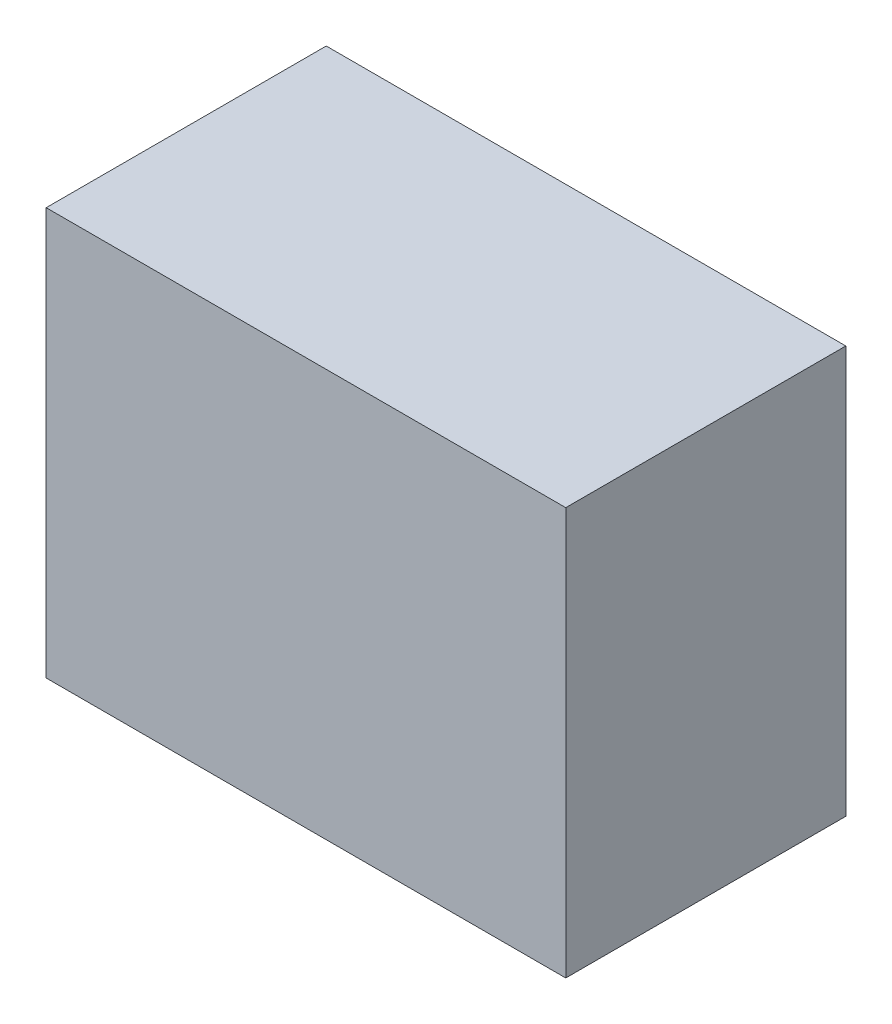
ISO-10303-21;
HEADER;
FILE_DESCRIPTION(('STEP AP214'),'2;1');
FILE_NAME('part.step','',(''),(''),'','','');
FILE_SCHEMA(('AUTOMOTIVE_DESIGN { 1 0 10303 214 1 1 1 1 }'));
ENDSEC;
DATA;
#1=APPLICATION_CONTEXT('core data for automotive mechanical design processes');
#2=APPLICATION_PROTOCOL_DEFINITION('international standard','automotive_design',2000,#1);
#3=PRODUCT_CONTEXT('',#1,'mechanical');
#4=PRODUCT('Part','Part','',(#3));
#5=PRODUCT_RELATED_PRODUCT_CATEGORY('part','',(#4));
#6=PRODUCT_DEFINITION_FORMATION('','',#4);
#7=PRODUCT_DEFINITION_CONTEXT('part definition',#1,'design');
#8=PRODUCT_DEFINITION('design','',#6,#7);
#9=PRODUCT_DEFINITION_SHAPE('','',#8);
#10=(LENGTH_UNIT() NAMED_UNIT(*) SI_UNIT(.MILLI.,.METRE.));
#11=(NAMED_UNIT(*) PLANE_ANGLE_UNIT() SI_UNIT($,.RADIAN.));
#12=(NAMED_UNIT(*) SI_UNIT($,.STERADIAN.) SOLID_ANGLE_UNIT());
#13=UNCERTAINTY_MEASURE_WITH_UNIT(LENGTH_MEASURE(1.E-05),#10,'distance_accuracy_value','');
#14=(GEOMETRIC_REPRESENTATION_CONTEXT(3) GLOBAL_UNCERTAINTY_ASSIGNED_CONTEXT((#13)) GLOBAL_UNIT_ASSIGNED_CONTEXT((#10,
#11,#12)) REPRESENTATION_CONTEXT('',''));
#15=CARTESIAN_POINT('',(0.,0.,0.));
#16=DIRECTION('',(0.,0.,1.));
#17=DIRECTION('',(1.,0.,0.));
#18=AXIS2_PLACEMENT_3D('',#15,#16,#17);
#19=CARTESIAN_POINT('',(0.,0.,0.539));
#20=DIRECTION('',(0.,0.,1.));
#21=DIRECTION('',(1.,0.,0.));
#22=AXIS2_PLACEMENT_3D('',#19,#20,#21);
#23=PLANE('',#22);
#24=DIRECTION('',(0.,1.,0.));
#25=VECTOR('',#24,1.);
#26=CARTESIAN_POINT('',(1.,0.,0.539));
#27=LINE('',#26,#25);
#28=CARTESIAN_POINT('',(1.,0.784,0.539));
#29=VERTEX_POINT('',#28);
#30=CARTESIAN_POINT('',(1.,0.,0.539));
#31=VERTEX_POINT('',#30);
#32=EDGE_CURVE('E76',#29,#31,#27,.F.);
#33=ORIENTED_EDGE('',*,*,#32,.F.);
#34=DIRECTION('',(1.,0.,0.));
#35=VECTOR('',#34,1.);
#36=CARTESIAN_POINT('',(0.,0.784,0.539));
#37=LINE('',#36,#35);
#38=CARTESIAN_POINT('',(0.,0.784,0.539));
#39=VERTEX_POINT('',#38);
#40=EDGE_CURVE('E58',#39,#29,#37,.T.);
#41=ORIENTED_EDGE('',*,*,#40,.F.);
#42=DIRECTION('',(0.,1.,0.));
#43=VECTOR('',#42,1.);
#44=CARTESIAN_POINT('',(0.,0.,0.539));
#45=LINE('',#44,#43);
#46=CARTESIAN_POINT('',(0.,0.,0.539));
#47=VERTEX_POINT('',#46);
#48=EDGE_CURVE('E20',#39,#47,#45,.F.);
#49=ORIENTED_EDGE('',*,*,#48,.T.);
#50=DIRECTION('',(1.,0.,0.));
#51=VECTOR('',#50,1.);
#52=CARTESIAN_POINT('',(0.,0.,0.539));
#53=LINE('',#52,#51);
#54=EDGE_CURVE('E55',#47,#31,#53,.T.);
#55=ORIENTED_EDGE('',*,*,#54,.T.);
#56=EDGE_LOOP('',(#33,#41,#49,#55));
#57=FACE_BOUND('',#56,.T.);
#58=ADVANCED_FACE('F17',(#57),#23,.T.);
#59=CARTESIAN_POINT('',(0.,0.,0.));
#60=DIRECTION('',(1.,0.,0.));
#61=DIRECTION('',(0.,0.,-1.));
#62=AXIS2_PLACEMENT_3D('',#59,#60,#61);
#63=PLANE('',#62);
#64=DIRECTION('',(0.,0.,1.));
#65=VECTOR('',#64,1.);
#66=CARTESIAN_POINT('',(0.,0.784,0.));
#67=LINE('',#66,#65);
#68=CARTESIAN_POINT('',(0.,0.784,0.));
#69=VERTEX_POINT('',#68);
#70=EDGE_CURVE('E78',#69,#39,#67,.T.);
#71=ORIENTED_EDGE('',*,*,#70,.F.);
#72=DIRECTION('',(0.,1.,0.));
#73=VECTOR('',#72,1.);
#74=CARTESIAN_POINT('',(0.,0.,0.));
#75=LINE('',#74,#73);
#76=CARTESIAN_POINT('',(0.,0.,0.));
#77=VERTEX_POINT('',#76);
#78=EDGE_CURVE('E73',#69,#77,#75,.F.);
#79=ORIENTED_EDGE('',*,*,#78,.T.);
#80=DIRECTION('',(0.,0.,1.));
#81=VECTOR('',#80,1.);
#82=CARTESIAN_POINT('',(0.,0.,0.));
#83=LINE('',#82,#81);
#84=EDGE_CURVE('E63',#77,#47,#83,.T.);
#85=ORIENTED_EDGE('',*,*,#84,.T.);
#86=ORIENTED_EDGE('',*,*,#48,.F.);
#87=EDGE_LOOP('',(#71,#79,#85,#86));
#88=FACE_BOUND('',#87,.T.);
#89=ADVANCED_FACE('F72',(#88),#63,.F.);
#90=CARTESIAN_POINT('',(0.,0.,0.));
#91=DIRECTION('',(0.,1.,0.));
#92=DIRECTION('',(0.,0.,1.));
#93=AXIS2_PLACEMENT_3D('',#90,#91,#92);
#94=PLANE('',#93);
#95=ORIENTED_EDGE('',*,*,#54,.F.);
#96=ORIENTED_EDGE('',*,*,#84,.F.);
#97=DIRECTION('',(1.,0.,0.));
#98=VECTOR('',#97,1.);
#99=CARTESIAN_POINT('',(0.,0.,0.));
#100=LINE('',#99,#98);
#101=CARTESIAN_POINT('',(1.,0.,0.));
#102=VERTEX_POINT('',#101);
#103=EDGE_CURVE('E83',#77,#102,#100,.T.);
#104=ORIENTED_EDGE('',*,*,#103,.T.);
#105=DIRECTION('',(0.,0.,-1.));
#106=VECTOR('',#105,1.);
#107=CARTESIAN_POINT('',(1.,0.,0.));
#108=LINE('',#107,#106);
#109=EDGE_CURVE('E69',#31,#102,#108,.T.);
#110=ORIENTED_EDGE('',*,*,#109,.F.);
#111=EDGE_LOOP('',(#95,#96,#104,#110));
#112=FACE_BOUND('',#111,.T.);
#113=ADVANCED_FACE('F66',(#112),#94,.F.);
#114=CARTESIAN_POINT('',(1.,0.,0.));
#115=DIRECTION('',(1.,0.,0.));
#116=DIRECTION('',(0.,0.,-1.));
#117=AXIS2_PLACEMENT_3D('',#114,#115,#116);
#118=PLANE('',#117);
#119=DIRECTION('',(0.,0.,1.));
#120=VECTOR('',#119,1.);
#121=CARTESIAN_POINT('',(1.,0.784,0.));
#122=LINE('',#121,#120);
#123=CARTESIAN_POINT('',(1.,0.784,0.));
#124=VERTEX_POINT('',#123);
#125=EDGE_CURVE('E34',#29,#124,#122,.F.);
#126=ORIENTED_EDGE('',*,*,#125,.F.);
#127=ORIENTED_EDGE('',*,*,#32,.T.);
#128=ORIENTED_EDGE('',*,*,#109,.T.);
#129=DIRECTION('',(0.,1.,0.));
#130=VECTOR('',#129,1.);
#131=CARTESIAN_POINT('',(1.,0.,0.));
#132=LINE('',#131,#130);
#133=EDGE_CURVE('E26',#102,#124,#132,.T.);
#134=ORIENTED_EDGE('',*,*,#133,.T.);
#135=EDGE_LOOP('',(#126,#127,#128,#134));
#136=FACE_BOUND('',#135,.T.);
#137=ADVANCED_FACE('F88',(#136),#118,.T.);
#138=CARTESIAN_POINT('',(0.,0.784,0.));
#139=DIRECTION('',(0.,1.,0.));
#140=DIRECTION('',(0.,0.,1.));
#141=AXIS2_PLACEMENT_3D('',#138,#139,#140);
#142=PLANE('',#141);
#143=ORIENTED_EDGE('',*,*,#40,.T.);
#144=ORIENTED_EDGE('',*,*,#125,.T.);
#145=DIRECTION('',(1.,0.,0.));
#146=VECTOR('',#145,1.);
#147=CARTESIAN_POINT('',(0.,0.784,0.));
#148=LINE('',#147,#146);
#149=EDGE_CURVE('E11',#124,#69,#148,.F.);
#150=ORIENTED_EDGE('',*,*,#149,.T.);
#151=ORIENTED_EDGE('',*,*,#70,.T.);
#152=EDGE_LOOP('',(#143,#144,#150,#151));
#153=FACE_BOUND('',#152,.T.);
#154=ADVANCED_FACE('F91',(#153),#142,.T.);
#155=CARTESIAN_POINT('',(0.,0.,0.));
#156=DIRECTION('',(0.,0.,1.));
#157=DIRECTION('',(1.,0.,0.));
#158=AXIS2_PLACEMENT_3D('',#155,#156,#157);
#159=PLANE('',#158);
#160=ORIENTED_EDGE('',*,*,#133,.F.);
#161=ORIENTED_EDGE('',*,*,#103,.F.);
#162=ORIENTED_EDGE('',*,*,#78,.F.);
#163=ORIENTED_EDGE('',*,*,#149,.F.);
#164=EDGE_LOOP('',(#160,#161,#162,#163));
#165=FACE_BOUND('',#164,.T.);
#166=ADVANCED_FACE('F90',(#165),#159,.F.);
#167=CLOSED_SHELL('',(#58,#89,#113,#137,#154,#166));
#168=MANIFOLD_SOLID_BREP('B1',#167);
#169=ADVANCED_BREP_SHAPE_REPRESENTATION('',(#18,#168),#14);
#170=SHAPE_DEFINITION_REPRESENTATION(#9,#169);
ENDSEC;
END-ISO-10303-21;
